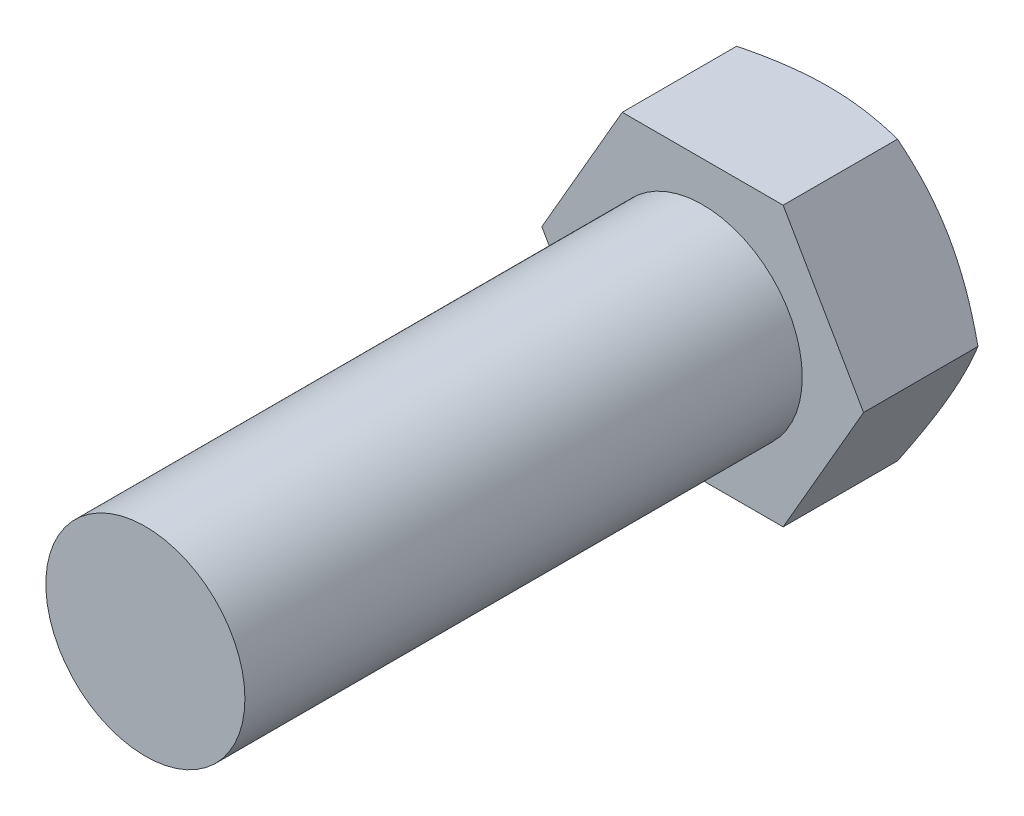
ISO-10303-21;
HEADER;
FILE_DESCRIPTION(('STEP AP214'),'2;1');
FILE_NAME('part.step','',(''),(''),'','','');
FILE_SCHEMA(('AUTOMOTIVE_DESIGN { 1 0 10303 214 1 1 1 1 }'));
ENDSEC;
DATA;
#1=APPLICATION_CONTEXT('core data for automotive mechanical design processes');
#2=APPLICATION_PROTOCOL_DEFINITION('international standard','automotive_design',2000,#1);
#3=PRODUCT_CONTEXT('',#1,'mechanical');
#4=PRODUCT('Part','Part','',(#3));
#5=PRODUCT_RELATED_PRODUCT_CATEGORY('part','',(#4));
#6=PRODUCT_DEFINITION_FORMATION('','',#4);
#7=PRODUCT_DEFINITION_CONTEXT('part definition',#1,'design');
#8=PRODUCT_DEFINITION('design','',#6,#7);
#9=PRODUCT_DEFINITION_SHAPE('','',#8);
#10=(LENGTH_UNIT() NAMED_UNIT(*) SI_UNIT(.MILLI.,.METRE.));
#11=(NAMED_UNIT(*) PLANE_ANGLE_UNIT() SI_UNIT($,.RADIAN.));
#12=(NAMED_UNIT(*) SI_UNIT($,.STERADIAN.) SOLID_ANGLE_UNIT());
#13=UNCERTAINTY_MEASURE_WITH_UNIT(LENGTH_MEASURE(1.E-05),#10,'distance_accuracy_value','');
#14=(GEOMETRIC_REPRESENTATION_CONTEXT(3) GLOBAL_UNCERTAINTY_ASSIGNED_CONTEXT((#13)) GLOBAL_UNIT_ASSIGNED_CONTEXT((#10,
#11,#12)) REPRESENTATION_CONTEXT('',''));
#15=CARTESIAN_POINT('',(0.,0.,0.));
#16=DIRECTION('',(0.,0.,1.));
#17=DIRECTION('',(1.,0.,0.));
#18=AXIS2_PLACEMENT_3D('',#15,#16,#17);
#19=CARTESIAN_POINT('',(5.77350269189626,-10.,9.));
#20=DIRECTION('',(-0.866025403784439,0.5,0.));
#21=DIRECTION('',(-0.5,-0.866025403784439,0.));
#22=AXIS2_PLACEMENT_3D('',#19,#20,#21);
#23=PLANE('',#22);
#24=CARTESIAN_POINT('',(11.5471208538463,0.000200000000005224,0.788297449360781));
#25=CARTESIAN_POINT('',(11.387470031637,-0.276323335536796,0.706955316827122));
#26=CARTESIAN_POINT('',(11.2271880395808,-0.553939889316469,0.630337695613419));
#27=CARTESIAN_POINT('',(10.9053269230436,-1.11141969613977,0.488112172233504));
#28=CARTESIAN_POINT('',(10.7437471833194,-1.39128401481579,0.422509859938756));
#29=CARTESIAN_POINT('',(10.4191548618995,-1.95349440726178,0.303865224573186));
#30=CARTESIAN_POINT('',(10.2561403838837,-2.2358437655545,0.250843409138608));
#31=CARTESIAN_POINT('',(9.92912849263812,-2.80224497587099,0.15907223367217));
#32=CARTESIAN_POINT('',(9.76513124975307,-3.0862965328491,0.120320468976677));
#33=CARTESIAN_POINT('',(9.44021030991308,-3.649076109095,0.0591129448256602));
#34=CARTESIAN_POINT('',(9.27930360708153,-3.92777469367763,0.0362998782970133));
#35=CARTESIAN_POINT('',(8.95711377885886,-4.48582384584119,0.00635442643000452));
#36=CARTESIAN_POINT('',(8.7958306361767,-4.76517444337107,-0.000777223835431902));
#37=CARTESIAN_POINT('',(8.47346565189556,-5.32352697472714,0.00091085193685532));
#38=CARTESIAN_POINT('',(8.31238378655497,-5.60252894967502,0.00971278117287127));
#39=CARTESIAN_POINT('',(7.99063991910936,-6.15980567511451,0.0429012621687012));
#40=CARTESIAN_POINT('',(7.82997788313788,-6.43808048426458,0.0672865152875638));
#41=CARTESIAN_POINT('',(7.51065226553226,-6.99116867811583,0.130523281933748));
#42=CARTESIAN_POINT('',(7.35198290678816,-7.26599206906497,0.169259440762759));
#43=CARTESIAN_POINT('',(7.0355782603448,-7.81402099245575,0.260002353604055));
#44=CARTESIAN_POINT('',(6.87784312460769,-8.08722626169119,0.312011209032834));
#45=CARTESIAN_POINT('',(6.56157812917106,-8.63501330244297,0.428568161247871));
#46=CARTESIAN_POINT('',(6.40306166480857,-8.90957187255499,0.493260059832045));
#47=CARTESIAN_POINT('',(6.08729071937631,-9.45650319359773,0.633221506311025));
#48=CARTESIAN_POINT('',(5.9300355730794,-9.72887709673566,0.708485029543129));
#49=CARTESIAN_POINT('',(5.77338722184242,-10.0002,0.788297449360783));
#50=B_SPLINE_CURVE_WITH_KNOTS('',3,(#24,#25,#26,#27,#28,#29,#30,#31,#32,#33,#34,#35,#36,#37,#38,
#39,#40,#41,#42,#43,#44,#45,#46,#47,#48,#49),.UNSPECIFIED.,.F.,.F.,(4,2,2,2,2,2,2,2,2,2,2,2,4),
(0.,0.988548302530218,1.97759675136622,2.96824655168217,3.95872933991936,4.92622626615817,
5.89376854325206,6.86023080346214,7.82661253375208,8.7853891728887,9.74431770582896,
10.7148230607558,11.684777561656),.UNSPECIFIED.);
#51=CARTESIAN_POINT('',(11.5470053837925,0.,0.78823861354718));
#52=VERTEX_POINT('',#51);
#53=CARTESIAN_POINT('',(8.66025403784439,-4.99999999999999,0.));
#54=VERTEX_POINT('',#53);
#55=EDGE_CURVE('E126',#52,#54,#50,.T.);
#56=ORIENTED_EDGE('',*,*,#55,.F.);
#57=DIRECTION('',(0.,0.,-1.));
#58=VECTOR('',#57,1.);
#59=CARTESIAN_POINT('',(11.5470053837925,0.,9.));
#60=LINE('',#59,#58);
#61=CARTESIAN_POINT('',(11.5470053837925,0.,9.));
#62=VERTEX_POINT('',#61);
#63=EDGE_CURVE('E130',#62,#52,#60,.T.);
#64=ORIENTED_EDGE('',*,*,#63,.F.);
#65=DIRECTION('',(0.5,0.866025403784439,0.));
#66=VECTOR('',#65,1.);
#67=CARTESIAN_POINT('',(5.77350269189626,-10.,9.));
#68=LINE('',#67,#66);
#69=CARTESIAN_POINT('',(5.77350269189626,-10.,9.));
#70=VERTEX_POINT('',#69);
#71=EDGE_CURVE('E225',#70,#62,#68,.T.);
#72=ORIENTED_EDGE('',*,*,#71,.F.);
#73=DIRECTION('',(0.,0.,-1.));
#74=VECTOR('',#73,1.);
#75=CARTESIAN_POINT('',(5.77350269189626,-10.,9.));
#76=LINE('',#75,#74);
#77=CARTESIAN_POINT('',(5.77350269189626,-10.,0.788238613547183));
#78=VERTEX_POINT('',#77);
#79=EDGE_CURVE('E213',#70,#78,#76,.T.);
#80=ORIENTED_EDGE('',*,*,#79,.T.);
#81=EDGE_CURVE('E181',#54,#78,#50,.T.);
#82=ORIENTED_EDGE('',*,*,#81,.F.);
#83=EDGE_LOOP('',(#56,#64,#72,#80,#82));
#84=FACE_BOUND('',#83,.T.);
#85=ADVANCED_FACE('F36',(#84),#23,.F.);
#86=CARTESIAN_POINT('',(11.5470053837925,0.,9.));
#87=DIRECTION('',(-0.866025403784438,-0.5,0.));
#88=DIRECTION('',(0.5,-0.866025403784439,0.));
#89=AXIS2_PLACEMENT_3D('',#86,#87,#88);
#90=PLANE('',#89);
#91=CARTESIAN_POINT('',(5.77338722184242,10.0002,0.788297449360782));
#92=CARTESIAN_POINT('',(5.9330380440518,9.7236766644632,0.706955316827123));
#93=CARTESIAN_POINT('',(6.09332003610799,9.44606011068353,0.63033769561342));
#94=CARTESIAN_POINT('',(6.4151811526452,8.88858030386023,0.488112172233505));
#95=CARTESIAN_POINT('',(6.57676089236938,8.6087159851842,0.422509859938757));
#96=CARTESIAN_POINT('',(6.90135321378928,8.04650559273821,0.303865224573187));
#97=CARTESIAN_POINT('',(7.06436769180509,7.7641562344455,0.250843409138609));
#98=CARTESIAN_POINT('',(7.39137958305065,7.19775502412901,0.159072233672171));
#99=CARTESIAN_POINT('',(7.55537682593569,6.91370346715089,0.120320468976678));
#100=CARTESIAN_POINT('',(7.88029776577569,6.350923890905,0.0591129448256617));
#101=CARTESIAN_POINT('',(8.04120446860724,6.07222530632237,0.0362998782970149));
#102=CARTESIAN_POINT('',(8.36339429682991,5.51417615415881,0.00635442643000559));
#103=CARTESIAN_POINT('',(8.52467743951207,5.23482555662893,-0.00077722383543137));
#104=CARTESIAN_POINT('',(8.8470424237932,4.67647302527286,0.00091085193685523));
#105=CARTESIAN_POINT('',(9.0081242891338,4.39747105032498,0.0097127811728711));
#106=CARTESIAN_POINT('',(9.3298681565794,3.84019432488549,0.0429012621687014));
#107=CARTESIAN_POINT('',(9.49053019255089,3.56191951573542,0.0672865152875644));
#108=CARTESIAN_POINT('',(9.80985581015651,3.00883132188416,0.130523281933749));
#109=CARTESIAN_POINT('',(9.96852516890061,2.73400793093502,0.169259440762759));
#110=CARTESIAN_POINT('',(10.284929815344,2.18597900754425,0.260002353604054));
#111=CARTESIAN_POINT('',(10.4426649510811,1.91277373830881,0.312011209032833));
#112=CARTESIAN_POINT('',(10.7589299465177,1.36498669755703,0.428568161247869));
#113=CARTESIAN_POINT('',(10.9174464108802,1.09042812744501,0.493260059832043));
#114=CARTESIAN_POINT('',(11.2332173563125,0.543496806402273,0.633221506311022));
#115=CARTESIAN_POINT('',(11.3904725026094,0.271122903264344,0.708485029543126));
#116=CARTESIAN_POINT('',(11.5471208538463,-0.000199999999995149,0.78829744936078));
#117=B_SPLINE_CURVE_WITH_KNOTS('',3,(#91,#92,#93,#94,#95,#96,#97,#98,#99,#100,#101,#102,#103,
#104,#105,#106,#107,#108,#109,#110,#111,#112,#113,#114,#115,#116),.UNSPECIFIED.,.F.,.F.,(4,2,2,
2,2,2,2,2,2,2,2,2,4),(0.,0.98854830253022,1.97759675136622,2.96824655168217,3.95872933991936,
4.92622626615817,5.89376854325206,6.86023080346214,7.82661253375208,8.7853891728887,
9.74431770582895,10.7148230607558,11.684777561656),.UNSPECIFIED.);
#118=CARTESIAN_POINT('',(5.77350269189625,10.,0.788238613547182));
#119=VERTEX_POINT('',#118);
#120=CARTESIAN_POINT('',(8.66025403784438,5.,0.));
#121=VERTEX_POINT('',#120);
#122=EDGE_CURVE('E107',#119,#121,#117,.T.);
#123=ORIENTED_EDGE('',*,*,#122,.F.);
#124=DIRECTION('',(0.,0.,-1.));
#125=VECTOR('',#124,1.);
#126=CARTESIAN_POINT('',(5.77350269189625,10.,9.));
#127=LINE('',#126,#125);
#128=CARTESIAN_POINT('',(5.77350269189625,10.,9.));
#129=VERTEX_POINT('',#128);
#130=EDGE_CURVE('E210',#129,#119,#127,.T.);
#131=ORIENTED_EDGE('',*,*,#130,.F.);
#132=DIRECTION('',(-0.5,0.866025403784439,0.));
#133=VECTOR('',#132,1.);
#134=CARTESIAN_POINT('',(11.5470053837925,0.,9.));
#135=LINE('',#134,#133);
#136=EDGE_CURVE('E222',#62,#129,#135,.T.);
#137=ORIENTED_EDGE('',*,*,#136,.F.);
#138=ORIENTED_EDGE('',*,*,#63,.T.);
#139=EDGE_CURVE('E119',#121,#52,#117,.T.);
#140=ORIENTED_EDGE('',*,*,#139,.F.);
#141=EDGE_LOOP('',(#123,#131,#137,#138,#140));
#142=FACE_BOUND('',#141,.T.);
#143=ADVANCED_FACE('F135',(#142),#90,.F.);
#144=CARTESIAN_POINT('',(5.77350269189625,10.,9.));
#145=DIRECTION('',(0.,-1.,0.));
#146=DIRECTION('',(0.,0.,-1.));
#147=AXIS2_PLACEMENT_3D('',#144,#145,#146);
#148=PLANE('',#147);
#149=CARTESIAN_POINT('',(-15.5906778031145,10.,4.34224121968027));
#150=CARTESIAN_POINT('',(-15.3663468133813,10.,4.24603117210479));
#151=CARTESIAN_POINT('',(-15.1417981887708,10.,4.15032883474606));
#152=CARTESIAN_POINT('',(-14.6922198716169,10.,3.96005546915711));
#153=CARTESIAN_POINT('',(-14.467190174769,10.,3.86548445110034));
#154=CARTESIAN_POINT('',(-13.7912590342091,10.,3.58362069261418));
#155=CARTESIAN_POINT('',(-13.3395730680817,10.,3.39820198962765));
#156=CARTESIAN_POINT('',(-12.4318951737071,10.,3.03282276318022));
#157=CARTESIAN_POINT('',(-11.9758932518863,10.,2.85288700616884));
#158=CARTESIAN_POINT('',(-11.0608901088049,10.,2.50083333408515));
#159=CARTESIAN_POINT('',(-10.6018890052941,10.,2.32871511417557));
#160=CARTESIAN_POINT('',(-9.6822006956297,10.,1.9950471749154));
#161=CARTESIAN_POINT('',(-9.22152840961594,10.,1.83345653122118));
#162=CARTESIAN_POINT('',(-8.29593875779185,10.,1.5227213620607));
#163=CARTESIAN_POINT('',(-7.83102110026934,10.,1.3735776991127));
#164=CARTESIAN_POINT('',(-6.8969496609401,10.,1.09137183829813));
#165=CARTESIAN_POINT('',(-6.42780214799029,10.,0.958289055250837));
#166=CARTESIAN_POINT('',(-5.48425121625148,10.,0.712282641680592));
#167=CARTESIAN_POINT('',(-5.00984880344241,10.,0.599355221172559));
#168=CARTESIAN_POINT('',(-4.2368014044977,10.,0.436743421708876));
#169=CARTESIAN_POINT('',(-3.939781290754,10.,0.379322297630709));
#170=CARTESIAN_POINT('',(-3.34382265781949,10.,0.275413853167234));
#171=CARTESIAN_POINT('',(-3.04488418287569,10.,0.228926281524037));
#172=CARTESIAN_POINT('',(-2.44544240181704,10.,0.148074472012329));
#173=CARTESIAN_POINT('',(-2.14493954574698,10.,0.113706923974092));
#174=CARTESIAN_POINT('',(-1.54271361567941,10.,0.0580685039253847));
#175=CARTESIAN_POINT('',(-1.24099054883684,10.,0.0367975552323622));
#176=CARTESIAN_POINT('',(-0.636967641043603,10.,0.00802778569664055));
#177=CARTESIAN_POINT('',(-0.334667987917066,10.,0.00052506108888461));
#178=CARTESIAN_POINT('',(0.269953031124403,10.,-0.000471713587558138));
#179=CARTESIAN_POINT('',(0.572274396915812,10.,0.00603416212456599));
#180=CARTESIAN_POINT('',(1.17625447985903,10.,0.0328366842888231));
#181=CARTESIAN_POINT('',(1.47791328797712,10.,0.0531313011983849));
#182=CARTESIAN_POINT('',(2.08005388872123,10.,0.106866392340892));
#183=CARTESIAN_POINT('',(2.38053564898709,10.,0.14030722547166));
#184=CARTESIAN_POINT('',(2.98649405325498,10.,0.220236278068658));
#185=CARTESIAN_POINT('',(3.29193462066067,10.,0.266996099810119));
#186=CARTESIAN_POINT('',(3.90085018096802,10.,0.371992411341787));
#187=CARTESIAN_POINT('',(4.20432494302106,10.,0.43023022465617));
#188=CARTESIAN_POINT('',(5.11180953855662,10.,0.620204919765222));
#189=CARTESIAN_POINT('',(5.71264483088102,10.,0.767170108264837));
#190=CARTESIAN_POINT('',(6.90850485451447,10.,1.09228442120651));
#191=CARTESIAN_POINT('',(7.50349096323372,10.,1.27057171626315));
#192=CARTESIAN_POINT('',(8.68603550894149,10.,1.64968107252888));
#193=CARTESIAN_POINT('',(9.2735953851362,10.,1.85049869046892));
#194=CARTESIAN_POINT('',(10.4547643173347,10.,2.27301330282843));
#195=CARTESIAN_POINT('',(11.0482488991774,10.,2.49505502001829));
#196=CARTESIAN_POINT('',(12.2303102047308,10.,2.95189832799039));
#197=CARTESIAN_POINT('',(12.8188865387549,10.,3.18670092099485));
#198=CARTESIAN_POINT('',(13.9855145960403,10.,3.66316700201162));
#199=CARTESIAN_POINT('',(14.5636102009072,10.,3.9047234603681));
#200=CARTESIAN_POINT('',(15.4283880972246,10.,4.27239635657626));
#201=CARTESIAN_POINT('',(15.7162173014116,10.,4.39582792245027));
#202=CARTESIAN_POINT('',(16.2911862328645,10.,4.64427599369527));
#203=CARTESIAN_POINT('',(16.5783259698353,10.,4.76929247659992));
#204=CARTESIAN_POINT('',(16.8651623579786,10.,4.89500127887226));
#205=B_SPLINE_CURVE_WITH_KNOTS('',3,(#149,#150,#151,#152,#153,#154,#155,#156,#157,#158,#159,
#160,#161,#162,#163,#164,#165,#166,#167,#168,#169,#170,#171,#172,#173,#174,#175,#176,#177,#178,
#179,#180,#181,#182,#183,#184,#185,#186,#187,#188,#189,#190,#191,#192,#193,#194,#195,#196,#197,
#198,#199,#200,#201,#202,#203,#204),.UNSPECIFIED.,.F.,.F.,(4,2,2,2,2,2,2,2,2,2,2,2,2,2,2,2,2,2,
2,2,2,2,2,2,2,2,2,4),(0.,0.732273976566909,1.46455453320455,2.92930350472758,4.39990451463084,
5.87044813055646,7.33488426440034,8.79942179278838,10.2620618305191,11.7244265451148,
12.6318138400831,13.5391802808505,14.4462987132518,15.3534118342882,16.2602677177943,
17.1671187966845,18.0738364265353,18.9805788119188,19.9073279070681,20.8341839279988,
22.6886058177359,24.5514234705588,26.4138743954456,28.3146661926302,30.2156074918217,
32.0951432655484,33.0346762206901,33.9741958727319),.UNSPECIFIED.);
#206=CARTESIAN_POINT('',(-5.77350269189626,10.,0.788238613547184));
#207=VERTEX_POINT('',#206);
#208=CARTESIAN_POINT('',(0.,10.,0.));
#209=VERTEX_POINT('',#208);
#210=EDGE_CURVE('E52',#207,#209,#205,.T.);
#211=ORIENTED_EDGE('',*,*,#210,.F.);
#212=DIRECTION('',(0.,0.,-1.));
#213=VECTOR('',#212,1.);
#214=CARTESIAN_POINT('',(-5.77350269189626,10.,9.));
#215=LINE('',#214,#213);
#216=CARTESIAN_POINT('',(-5.77350269189626,10.,9.));
#217=VERTEX_POINT('',#216);
#218=EDGE_CURVE('E207',#217,#207,#215,.T.);
#219=ORIENTED_EDGE('',*,*,#218,.F.);
#220=DIRECTION('',(-1.,0.,0.));
#221=VECTOR('',#220,1.);
#222=CARTESIAN_POINT('',(5.77350269189625,10.,9.));
#223=LINE('',#222,#221);
#224=EDGE_CURVE('E221',#129,#217,#223,.T.);
#225=ORIENTED_EDGE('',*,*,#224,.F.);
#226=ORIENTED_EDGE('',*,*,#130,.T.);
#227=EDGE_CURVE('E113',#209,#119,#205,.T.);
#228=ORIENTED_EDGE('',*,*,#227,.F.);
#229=EDGE_LOOP('',(#211,#219,#225,#226,#228));
#230=FACE_BOUND('',#229,.T.);
#231=ADVANCED_FACE('F219',(#230),#148,.F.);
#232=CARTESIAN_POINT('',(-5.77350269189626,10.,9.));
#233=DIRECTION('',(0.866025403784439,-0.5,0.));
#234=DIRECTION('',(0.5,0.866025403784439,0.));
#235=AXIS2_PLACEMENT_3D('',#232,#233,#234);
#236=PLANE('',#235);
#237=CARTESIAN_POINT('',(-11.5471208538464,-0.000200000000001473,0.788297449360783));
#238=CARTESIAN_POINT('',(-11.387470031637,0.276323335536799,0.706955316827124));
#239=CARTESIAN_POINT('',(-11.2271880395808,0.553939889316473,0.630337695613421));
#240=CARTESIAN_POINT('',(-10.9053269230436,1.11141969613977,0.488112172233506));
#241=CARTESIAN_POINT('',(-10.7437471833194,1.3912840148158,0.422509859938759));
#242=CARTESIAN_POINT('',(-10.4191548618995,1.95349440726179,0.303865224573189));
#243=CARTESIAN_POINT('',(-10.2561403838837,2.2358437655545,0.250843409138611));
#244=CARTESIAN_POINT('',(-9.92912849263812,2.80224497587099,0.159072233672173));
#245=CARTESIAN_POINT('',(-9.76513124975308,3.08629653284911,0.12032046897668));
#246=CARTESIAN_POINT('',(-9.44021030991309,3.649076109095,0.0591129448256638));
#247=CARTESIAN_POINT('',(-9.27930360708154,3.92777469367763,0.0362998782970172));
#248=CARTESIAN_POINT('',(-8.95711377885887,4.48582384584119,0.00635442643000809));
#249=CARTESIAN_POINT('',(-8.7958306361767,4.76517444337108,-0.000777223835429106));
#250=CARTESIAN_POINT('',(-8.47346565189557,5.32352697472714,0.000910851936857824));
#251=CARTESIAN_POINT('',(-8.31238378655497,5.60252894967502,0.00971278117287419));
#252=CARTESIAN_POINT('',(-7.99063991910937,6.15980567511451,0.0429012621687041));
#253=CARTESIAN_POINT('',(-7.82997788313789,6.43808048426458,0.0672865152875661));
#254=CARTESIAN_POINT('',(-7.51065226553226,6.99116867811583,0.13052328193375));
#255=CARTESIAN_POINT('',(-7.35198290678817,7.26599206906497,0.169259440762761));
#256=CARTESIAN_POINT('',(-7.0355782603448,7.81402099245575,0.260002353604057));
#257=CARTESIAN_POINT('',(-6.8778431246077,8.08722626169119,0.312011209032835));
#258=CARTESIAN_POINT('',(-6.56157812917107,8.63501330244297,0.428568161247872));
#259=CARTESIAN_POINT('',(-6.40306166480858,8.90957187255499,0.493260059832046));
#260=CARTESIAN_POINT('',(-6.08729071937631,9.45650319359773,0.633221506311027));
#261=CARTESIAN_POINT('',(-5.9300355730794,9.72887709673566,0.708485029543131));
#262=CARTESIAN_POINT('',(-5.77338722184242,10.0002,0.788297449360784));
#263=B_SPLINE_CURVE_WITH_KNOTS('',3,(#237,#238,#239,#240,#241,#242,#243,#244,#245,#246,#247,
#248,#249,#250,#251,#252,#253,#254,#255,#256,#257,#258,#259,#260,#261,#262),.UNSPECIFIED.,.F.,
.F.,(4,2,2,2,2,2,2,2,2,2,2,2,4),(0.,0.98854830253022,1.97759675136622,2.96824655168217,
3.95872933991935,4.92622626615817,5.89376854325206,6.86023080346214,7.82661253375208,
8.7853891728887,9.74431770582895,10.7148230607558,11.684777561656),.UNSPECIFIED.);
#264=CARTESIAN_POINT('',(-11.5470053837925,0.,0.788238613547184));
#265=VERTEX_POINT('',#264);
#266=CARTESIAN_POINT('',(-8.66025403784439,5.,0.));
#267=VERTEX_POINT('',#266);
#268=EDGE_CURVE('E59',#265,#267,#263,.T.);
#269=ORIENTED_EDGE('',*,*,#268,.F.);
#270=DIRECTION('',(0.,0.,-1.));
#271=VECTOR('',#270,1.);
#272=CARTESIAN_POINT('',(-11.5470053837925,0.,9.));
#273=LINE('',#272,#271);
#274=CARTESIAN_POINT('',(-11.5470053837925,0.,9.));
#275=VERTEX_POINT('',#274);
#276=EDGE_CURVE('E201',#275,#265,#273,.T.);
#277=ORIENTED_EDGE('',*,*,#276,.F.);
#278=DIRECTION('',(-0.5,-0.866025403784439,0.));
#279=VECTOR('',#278,1.);
#280=CARTESIAN_POINT('',(-5.77350269189626,10.,9.));
#281=LINE('',#280,#279);
#282=EDGE_CURVE('E240',#217,#275,#281,.T.);
#283=ORIENTED_EDGE('',*,*,#282,.F.);
#284=ORIENTED_EDGE('',*,*,#218,.T.);
#285=EDGE_CURVE('E118',#267,#207,#263,.T.);
#286=ORIENTED_EDGE('',*,*,#285,.F.);
#287=EDGE_LOOP('',(#269,#277,#283,#284,#286));
#288=FACE_BOUND('',#287,.T.);
#289=ADVANCED_FACE('F199',(#288),#236,.F.);
#290=CARTESIAN_POINT('',(-11.5470053837925,0.,9.));
#291=DIRECTION('',(0.866025403784438,0.5,0.));
#292=DIRECTION('',(-0.5,0.866025403784439,0.));
#293=AXIS2_PLACEMENT_3D('',#290,#291,#292);
#294=PLANE('',#293);
#295=CARTESIAN_POINT('',(-5.77338722184242,-10.0002,0.788297449360782));
#296=CARTESIAN_POINT('',(-5.93303804405181,-9.7236766644632,0.706955316827123));
#297=CARTESIAN_POINT('',(-6.093320036108,-9.44606011068353,0.63033769561342));
#298=CARTESIAN_POINT('',(-6.41518115264521,-8.88858030386023,0.488112172233506));
#299=CARTESIAN_POINT('',(-6.57676089236938,-8.6087159851842,0.422509859938759));
#300=CARTESIAN_POINT('',(-6.90135321378928,-8.04650559273821,0.303865224573189));
#301=CARTESIAN_POINT('',(-7.0643676918051,-7.7641562344455,0.250843409138611));
#302=CARTESIAN_POINT('',(-7.39137958305065,-7.197755024129,0.159072233672172));
#303=CARTESIAN_POINT('',(-7.5553768259357,-6.91370346715089,0.120320468976679));
#304=CARTESIAN_POINT('',(-7.88029776577569,-6.350923890905,0.0591129448256632));
#305=CARTESIAN_POINT('',(-8.04120446860724,-6.07222530632236,0.0362998782970173));
#306=CARTESIAN_POINT('',(-8.36339429682991,-5.51417615415881,0.00635442643000846));
#307=CARTESIAN_POINT('',(-8.52467743951208,-5.23482555662892,-0.000777223835429166));
#308=CARTESIAN_POINT('',(-8.84704242379321,-4.67647302527286,0.000910851936857447));
#309=CARTESIAN_POINT('',(-9.00812428913381,-4.39747105032497,0.009712781172874));
#310=CARTESIAN_POINT('',(-9.32986815657941,-3.84019432488549,0.0429012621687042));
#311=CARTESIAN_POINT('',(-9.49053019255089,-3.56191951573542,0.0672865152875664));
#312=CARTESIAN_POINT('',(-9.80985581015652,-3.00883132188416,0.13052328193375));
#313=CARTESIAN_POINT('',(-9.96852516890061,-2.73400793093502,0.169259440762761));
#314=CARTESIAN_POINT('',(-10.284929815344,-2.18597900754425,0.260002353604057));
#315=CARTESIAN_POINT('',(-10.4426649510811,-1.91277373830881,0.312011209032836));
#316=CARTESIAN_POINT('',(-10.7589299465177,-1.36498669755703,0.428568161247873));
#317=CARTESIAN_POINT('',(-10.9174464108802,-1.09042812744501,0.493260059832047));
#318=CARTESIAN_POINT('',(-11.2332173563125,-0.543496806402269,0.633221506311026));
#319=CARTESIAN_POINT('',(-11.3904725026094,-0.27112290326434,0.70848502954313));
#320=CARTESIAN_POINT('',(-11.5471208538464,0.000199999999998581,0.788297449360783));
#321=B_SPLINE_CURVE_WITH_KNOTS('',3,(#295,#296,#297,#298,#299,#300,#301,#302,#303,#304,#305,
#306,#307,#308,#309,#310,#311,#312,#313,#314,#315,#316,#317,#318,#319,#320),.UNSPECIFIED.,.F.,
.F.,(4,2,2,2,2,2,2,2,2,2,2,2,4),(0.,0.988548302530218,1.97759675136622,2.96824655168217,
3.95872933991936,4.92622626615818,5.89376854325206,6.86023080346214,7.82661253375208,
8.7853891728887,9.74431770582895,10.7148230607558,11.684777561656),.UNSPECIFIED.);
#322=CARTESIAN_POINT('',(-5.77350269189659,-10.,0.78823861354691));
#323=VERTEX_POINT('',#322);
#324=CARTESIAN_POINT('',(-8.66025403784438,-5.,0.));
#325=VERTEX_POINT('',#324);
#326=EDGE_CURVE('E175',#323,#325,#321,.T.);
#327=ORIENTED_EDGE('',*,*,#326,.F.);
#328=DIRECTION('',(0.,0.,-1.));
#329=VECTOR('',#328,1.);
#330=CARTESIAN_POINT('',(-5.77350269189626,-10.,9.));
#331=LINE('',#330,#329);
#332=CARTESIAN_POINT('',(-5.77350269189626,-10.,9.));
#333=VERTEX_POINT('',#332);
#334=EDGE_CURVE('E208',#333,#323,#331,.T.);
#335=ORIENTED_EDGE('',*,*,#334,.F.);
#336=DIRECTION('',(0.5,-0.866025403784439,0.));
#337=VECTOR('',#336,1.);
#338=CARTESIAN_POINT('',(-11.5470053837925,0.,9.));
#339=LINE('',#338,#337);
#340=EDGE_CURVE('E206',#275,#333,#339,.T.);
#341=ORIENTED_EDGE('',*,*,#340,.F.);
#342=ORIENTED_EDGE('',*,*,#276,.T.);
#343=EDGE_CURVE('E137',#325,#265,#321,.T.);
#344=ORIENTED_EDGE('',*,*,#343,.F.);
#345=EDGE_LOOP('',(#327,#335,#341,#342,#344));
#346=FACE_BOUND('',#345,.T.);
#347=ADVANCED_FACE('F204',(#346),#294,.F.);
#348=CARTESIAN_POINT('',(-5.77350269189626,-10.,9.));
#349=DIRECTION('',(0.,1.,0.));
#350=DIRECTION('',(-1.,0.,0.));
#351=AXIS2_PLACEMENT_3D('',#348,#349,#350);
#352=PLANE('',#351);
#353=CARTESIAN_POINT('',(-15.5906778031145,-10.,4.34224121968027));
#354=CARTESIAN_POINT('',(-15.3663468133813,-10.,4.24603117210478));
#355=CARTESIAN_POINT('',(-15.1417981887708,-10.,4.15032883474606));
#356=CARTESIAN_POINT('',(-14.6922198716169,-10.,3.96005546915711));
#357=CARTESIAN_POINT('',(-14.467190174769,-10.,3.86548445110034));
#358=CARTESIAN_POINT('',(-13.7912590342091,-10.,3.58362069261418));
#359=CARTESIAN_POINT('',(-13.3395730680817,-10.,3.39820198962765));
#360=CARTESIAN_POINT('',(-12.4318951737071,-10.,3.03282276318022));
#361=CARTESIAN_POINT('',(-11.9758932518864,-10.,2.85288700616884));
#362=CARTESIAN_POINT('',(-11.0608901088049,-10.,2.50083333408515));
#363=CARTESIAN_POINT('',(-10.6018890052941,-10.,2.32871511417557));
#364=CARTESIAN_POINT('',(-9.6822006956297,-10.,1.9950471749154));
#365=CARTESIAN_POINT('',(-9.22152840961594,-10.,1.83345653122118));
#366=CARTESIAN_POINT('',(-8.29593875779185,-10.,1.5227213620607));
#367=CARTESIAN_POINT('',(-7.83102110026934,-10.,1.3735776991127));
#368=CARTESIAN_POINT('',(-6.8969496609401,-10.,1.09137183829813));
#369=CARTESIAN_POINT('',(-6.42780214799029,-10.,0.958289055250835));
#370=CARTESIAN_POINT('',(-5.48425121625148,-10.,0.712282641680591));
#371=CARTESIAN_POINT('',(-5.00984880344241,-10.,0.599355221172558));
#372=CARTESIAN_POINT('',(-4.2368014044977,-10.,0.436743421708876));
#373=CARTESIAN_POINT('',(-3.939781290754,-10.,0.379322297630708));
#374=CARTESIAN_POINT('',(-3.34382265781949,-10.,0.275413853167234));
#375=CARTESIAN_POINT('',(-3.04488418287569,-10.,0.228926281524036));
#376=CARTESIAN_POINT('',(-2.44544240181704,-10.,0.148074472012328));
#377=CARTESIAN_POINT('',(-2.14493954574698,-10.,0.113706923974092));
#378=CARTESIAN_POINT('',(-1.54271361567941,-10.,0.0580685039253839));
#379=CARTESIAN_POINT('',(-1.24099054883684,-10.,0.0367975552323608));
#380=CARTESIAN_POINT('',(-0.636967641043604,-10.,0.00802778569663918));
#381=CARTESIAN_POINT('',(-0.334667987917067,-10.,0.000525061088883879));
#382=CARTESIAN_POINT('',(0.269953031124402,-10.,-0.000471713587558295));
#383=CARTESIAN_POINT('',(0.572274396915811,-10.,0.00603416212456576));
#384=CARTESIAN_POINT('',(1.17625447985903,-10.,0.0328366842888226));
#385=CARTESIAN_POINT('',(1.47791328797712,-10.,0.0531313011983843));
#386=CARTESIAN_POINT('',(2.08005388872123,-10.,0.106866392340892));
#387=CARTESIAN_POINT('',(2.38053564898709,-10.,0.14030722547166));
#388=CARTESIAN_POINT('',(2.98649405325498,-10.,0.220236278068658));
#389=CARTESIAN_POINT('',(3.29193462066067,-10.,0.266996099810118));
#390=CARTESIAN_POINT('',(3.90085018096802,-10.,0.371992411341786));
#391=CARTESIAN_POINT('',(4.20432494302106,-10.,0.430230224656169));
#392=CARTESIAN_POINT('',(5.11180953855662,-10.,0.620204919765221));
#393=CARTESIAN_POINT('',(5.71264483088102,-10.,0.767170108264836));
#394=CARTESIAN_POINT('',(6.90850485451447,-10.,1.09228442120651));
#395=CARTESIAN_POINT('',(7.50349096323371,-10.,1.27057171626315));
#396=CARTESIAN_POINT('',(8.68603550894149,-10.,1.64968107252888));
#397=CARTESIAN_POINT('',(9.2735953851362,-10.,1.85049869046892));
#398=CARTESIAN_POINT('',(10.4547643173347,-10.,2.27301330282843));
#399=CARTESIAN_POINT('',(11.0482488991774,-10.,2.49505502001829));
#400=CARTESIAN_POINT('',(12.2303102047308,-10.,2.95189832799039));
#401=CARTESIAN_POINT('',(12.8188865387549,-10.,3.18670092099485));
#402=CARTESIAN_POINT('',(13.9855145960403,-10.,3.66316700201162));
#403=CARTESIAN_POINT('',(14.5636102009072,-10.,3.90472346036811));
#404=CARTESIAN_POINT('',(15.4283880972246,-10.,4.27239635657626));
#405=CARTESIAN_POINT('',(15.7162173014116,-10.,4.39582792245027));
#406=CARTESIAN_POINT('',(16.2911862328645,-10.,4.64427599369527));
#407=CARTESIAN_POINT('',(16.5783259698353,-10.,4.76929247659993));
#408=CARTESIAN_POINT('',(16.8651623579786,-10.,4.89500127887226));
#409=B_SPLINE_CURVE_WITH_KNOTS('',3,(#353,#354,#355,#356,#357,#358,#359,#360,#361,#362,#363,
#364,#365,#366,#367,#368,#369,#370,#371,#372,#373,#374,#375,#376,#377,#378,#379,#380,#381,#382,
#383,#384,#385,#386,#387,#388,#389,#390,#391,#392,#393,#394,#395,#396,#397,#398,#399,#400,#401,
#402,#403,#404,#405,#406,#407,#408),.UNSPECIFIED.,.F.,.F.,(4,2,2,2,2,2,2,2,2,2,2,2,2,2,2,2,2,2,
2,2,2,2,2,2,2,2,2,4),(0.,0.732273976566908,1.46455453320455,2.92930350472758,4.39990451463084,
5.87044813055646,7.33488426440034,8.79942179278838,10.2620618305191,11.7244265451148,
12.6318138400831,13.5391802808505,14.4462987132518,15.3534118342882,16.2602677177943,
17.1671187966845,18.0738364265353,18.9805788119188,19.9073279070681,20.8341839279988,
22.6886058177359,24.5514234705588,26.4138743954456,28.3146661926302,30.2156074918217,
32.0951432655484,33.0346762206901,33.9741958727319),.UNSPECIFIED.);
#410=CARTESIAN_POINT('',(0.,-10.,0.));
#411=VERTEX_POINT('',#410);
#412=EDGE_CURVE('E188',#78,#411,#409,.F.);
#413=ORIENTED_EDGE('',*,*,#412,.F.);
#414=ORIENTED_EDGE('',*,*,#79,.F.);
#415=DIRECTION('',(1.,0.,0.));
#416=VECTOR('',#415,1.);
#417=CARTESIAN_POINT('',(-5.77350269189626,-10.,9.));
#418=LINE('',#417,#416);
#419=EDGE_CURVE('E230',#333,#70,#418,.T.);
#420=ORIENTED_EDGE('',*,*,#419,.F.);
#421=ORIENTED_EDGE('',*,*,#334,.T.);
#422=EDGE_CURVE('E166',#411,#323,#409,.F.);
#423=ORIENTED_EDGE('',*,*,#422,.F.);
#424=EDGE_LOOP('',(#413,#414,#420,#421,#423));
#425=FACE_BOUND('',#424,.T.);
#426=ADVANCED_FACE('F255',(#425),#352,.F.);
#427=CARTESIAN_POINT('',(0.,0.,9.));
#428=DIRECTION('',(0.,0.,1.));
#429=DIRECTION('',(1.,0.,0.));
#430=AXIS2_PLACEMENT_3D('',#427,#428,#429);
#431=PLANE('',#430);
#432=CARTESIAN_POINT('',(0.,0.,9.));
#433=DIRECTION('',(0.,0.,1.));
#434=DIRECTION('',(1.,0.,0.));
#435=AXIS2_PLACEMENT_3D('',#432,#433,#434);
#436=CIRCLE('',#435,7.14375);
#437=CARTESIAN_POINT('',(7.14375,0.,9.));
#438=VERTEX_POINT('',#437);
#439=EDGE_CURVE('E243',#438,#438,#436,.T.);
#440=ORIENTED_EDGE('',*,*,#439,.F.);
#441=EDGE_LOOP('',(#440));
#442=FACE_BOUND('',#441,.T.);
#443=ORIENTED_EDGE('',*,*,#71,.T.);
#444=ORIENTED_EDGE('',*,*,#136,.T.);
#445=ORIENTED_EDGE('',*,*,#224,.T.);
#446=ORIENTED_EDGE('',*,*,#282,.T.);
#447=ORIENTED_EDGE('',*,*,#340,.T.);
#448=ORIENTED_EDGE('',*,*,#419,.T.);
#449=EDGE_LOOP('',(#443,#444,#445,#446,#447,#448));
#450=FACE_BOUND('',#449,.T.);
#451=ADVANCED_FACE('F228',(#442,#450),#431,.T.);
#452=CARTESIAN_POINT('',(0.,0.,49.));
#453=DIRECTION('',(0.,0.,-1.));
#454=DIRECTION('',(-1.,0.,0.));
#455=AXIS2_PLACEMENT_3D('',#452,#453,#454);
#456=CYLINDRICAL_SURFACE('',#455,7.14375);
#457=CARTESIAN_POINT('',(0.,0.,49.));
#458=DIRECTION('',(0.,0.,1.));
#459=DIRECTION('',(1.,0.,0.));
#460=AXIS2_PLACEMENT_3D('',#457,#458,#459);
#461=CIRCLE('',#460,7.14375);
#462=CARTESIAN_POINT('',(7.14375,0.,49.));
#463=VERTEX_POINT('',#462);
#464=EDGE_CURVE('E234',#463,#463,#461,.T.);
#465=ORIENTED_EDGE('',*,*,#464,.F.);
#466=EDGE_LOOP('',(#465));
#467=FACE_BOUND('',#466,.T.);
#468=ORIENTED_EDGE('',*,*,#439,.T.);
#469=EDGE_LOOP('',(#468));
#470=FACE_BOUND('',#469,.T.);
#471=ADVANCED_FACE('F249',(#467,#470),#456,.T.);
#472=CARTESIAN_POINT('',(0.,0.,49.));
#473=DIRECTION('',(0.,0.,1.));
#474=DIRECTION('',(1.,0.,0.));
#475=AXIS2_PLACEMENT_3D('',#472,#473,#474);
#476=PLANE('',#475);
#477=ORIENTED_EDGE('',*,*,#464,.T.);
#478=EDGE_LOOP('',(#477));
#479=FACE_BOUND('',#478,.T.);
#480=ADVANCED_FACE('F161',(#479),#476,.T.);
#481=CARTESIAN_POINT('',(0.,0.,0.));
#482=DIRECTION('',(0.,0.,1.));
#483=DIRECTION('',(-1.,0.,0.));
#484=AXIS2_PLACEMENT_3D('',#481,#482,#483);
#485=CONICAL_SURFACE('',#484,10.,1.09955742875643);
#486=ORIENTED_EDGE('',*,*,#139,.T.);
#487=ORIENTED_EDGE('',*,*,#55,.T.);
#488=CARTESIAN_POINT('',(0.,0.,0.));
#489=DIRECTION('',(0.,0.,1.));
#490=DIRECTION('',(1.,0.,0.));
#491=AXIS2_PLACEMENT_3D('',#488,#489,#490);
#492=CIRCLE('',#491,10.);
#493=EDGE_CURVE('E40',#54,#121,#492,.T.);
#494=ORIENTED_EDGE('',*,*,#493,.T.);
#495=EDGE_LOOP('',(#486,#487,#494));
#496=FACE_BOUND('',#495,.T.);
#497=ADVANCED_FACE('F124',(#496),#485,.T.);
#498=ORIENTED_EDGE('',*,*,#81,.T.);
#499=ORIENTED_EDGE('',*,*,#412,.T.);
#500=EDGE_CURVE('E129',#411,#54,#492,.T.);
#501=ORIENTED_EDGE('',*,*,#500,.T.);
#502=EDGE_LOOP('',(#498,#499,#501));
#503=FACE_BOUND('',#502,.T.);
#504=ADVANCED_FACE('F283',(#503),#485,.T.);
#505=ORIENTED_EDGE('',*,*,#326,.T.);
#506=EDGE_CURVE('E373',#325,#411,#492,.T.);
#507=ORIENTED_EDGE('',*,*,#506,.T.);
#508=ORIENTED_EDGE('',*,*,#422,.T.);
#509=EDGE_LOOP('',(#505,#507,#508));
#510=FACE_BOUND('',#509,.T.);
#511=ADVANCED_FACE('F160',(#510),#485,.T.);
#512=ORIENTED_EDGE('',*,*,#268,.T.);
#513=EDGE_CURVE('E45',#267,#325,#492,.T.);
#514=ORIENTED_EDGE('',*,*,#513,.T.);
#515=ORIENTED_EDGE('',*,*,#343,.T.);
#516=EDGE_LOOP('',(#512,#514,#515));
#517=FACE_BOUND('',#516,.T.);
#518=ADVANCED_FACE('F159',(#517),#485,.T.);
#519=ORIENTED_EDGE('',*,*,#210,.T.);
#520=CARTESIAN_POINT('',(0.,0.,0.));
#521=DIRECTION('',(0.,0.,-1.));
#522=DIRECTION('',(-1.,0.,0.));
#523=AXIS2_PLACEMENT_3D('',#520,#521,#522);
#524=CIRCLE('',#523,10.);
#525=EDGE_CURVE('E133',#267,#209,#524,.T.);
#526=ORIENTED_EDGE('',*,*,#525,.F.);
#527=ORIENTED_EDGE('',*,*,#285,.T.);
#528=EDGE_LOOP('',(#519,#526,#527));
#529=FACE_BOUND('',#528,.T.);
#530=ADVANCED_FACE('F155',(#529),#485,.T.);
#531=ORIENTED_EDGE('',*,*,#227,.T.);
#532=ORIENTED_EDGE('',*,*,#122,.T.);
#533=EDGE_CURVE('E11',#121,#209,#492,.T.);
#534=ORIENTED_EDGE('',*,*,#533,.T.);
#535=EDGE_LOOP('',(#531,#532,#534));
#536=FACE_BOUND('',#535,.T.);
#537=ADVANCED_FACE('F109',(#536),#485,.T.);
#538=CARTESIAN_POINT('',(0.,0.,0.));
#539=DIRECTION('',(0.,0.,1.));
#540=DIRECTION('',(1.,0.,0.));
#541=AXIS2_PLACEMENT_3D('',#538,#539,#540);
#542=PLANE('',#541);
#543=ORIENTED_EDGE('',*,*,#533,.F.);
#544=ORIENTED_EDGE('',*,*,#493,.F.);
#545=ORIENTED_EDGE('',*,*,#500,.F.);
#546=ORIENTED_EDGE('',*,*,#506,.F.);
#547=ORIENTED_EDGE('',*,*,#513,.F.);
#548=ORIENTED_EDGE('',*,*,#525,.T.);
#549=EDGE_LOOP('',(#543,#544,#545,#546,#547,#548));
#550=FACE_BOUND('',#549,.T.);
#551=ADVANCED_FACE('F131',(#550),#542,.F.);
#552=CLOSED_SHELL('',(#85,#143,#231,#289,#347,#426,#451,#471,#480,#497,#504,#511,#518,#530,#537,#551));
#553=MANIFOLD_SOLID_BREP('B2',#552);
#554=ADVANCED_BREP_SHAPE_REPRESENTATION('',(#18,#553),#14);
#555=SHAPE_DEFINITION_REPRESENTATION(#9,#554);
ENDSEC;
END-ISO-10303-21;
